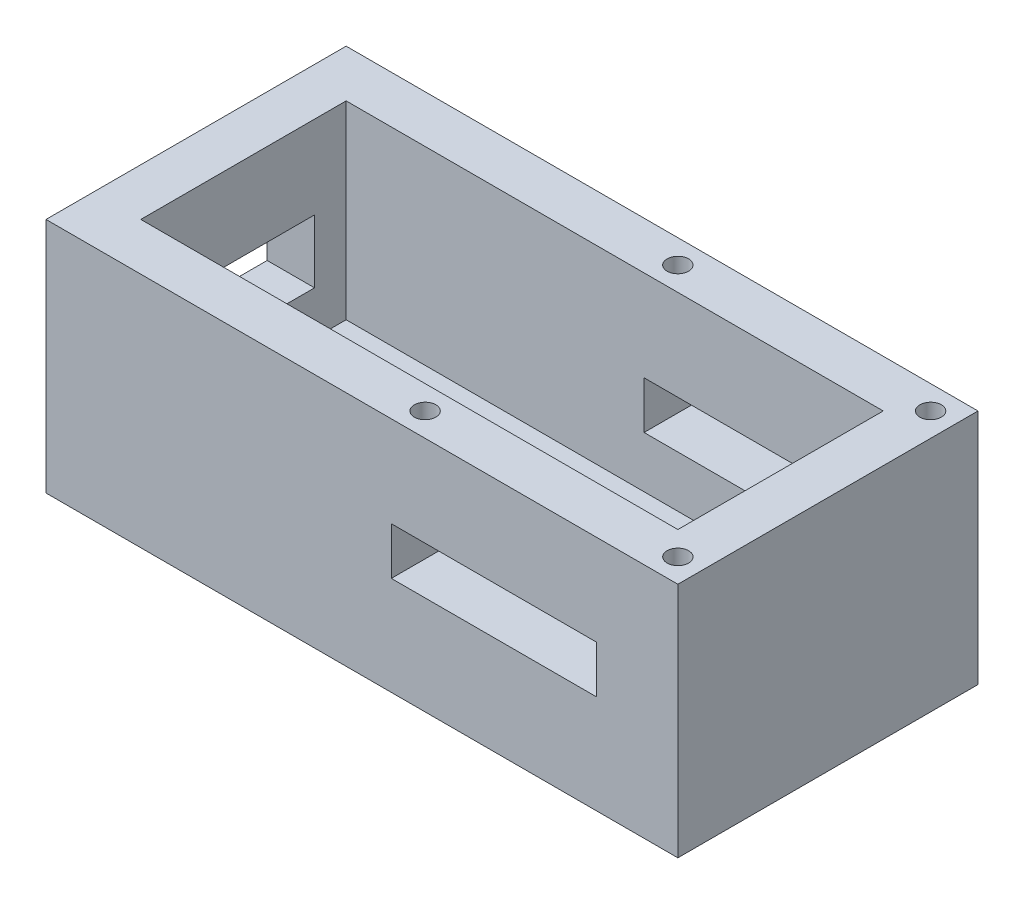
ISO-10303-21;
HEADER;
FILE_DESCRIPTION(('STEP AP214'),'2;1');
FILE_NAME('part.step','',(''),(''),'','','');
FILE_SCHEMA(('AUTOMOTIVE_DESIGN { 1 0 10303 214 1 1 1 1 }'));
ENDSEC;
DATA;
#1=APPLICATION_CONTEXT('core data for automotive mechanical design processes');
#2=APPLICATION_PROTOCOL_DEFINITION('international standard','automotive_design',2000,#1);
#3=PRODUCT_CONTEXT('',#1,'mechanical');
#4=PRODUCT('Part','Part','',(#3));
#5=PRODUCT_RELATED_PRODUCT_CATEGORY('part','',(#4));
#6=PRODUCT_DEFINITION_FORMATION('','',#4);
#7=PRODUCT_DEFINITION_CONTEXT('part definition',#1,'design');
#8=PRODUCT_DEFINITION('design','',#6,#7);
#9=PRODUCT_DEFINITION_SHAPE('','',#8);
#10=(LENGTH_UNIT() NAMED_UNIT(*) SI_UNIT(.MILLI.,.METRE.));
#11=(NAMED_UNIT(*) PLANE_ANGLE_UNIT() SI_UNIT($,.RADIAN.));
#12=(NAMED_UNIT(*) SI_UNIT($,.STERADIAN.) SOLID_ANGLE_UNIT());
#13=UNCERTAINTY_MEASURE_WITH_UNIT(LENGTH_MEASURE(1.E-05),#10,'distance_accuracy_value','');
#14=(GEOMETRIC_REPRESENTATION_CONTEXT(3) GLOBAL_UNCERTAINTY_ASSIGNED_CONTEXT((#13)) GLOBAL_UNIT_ASSIGNED_CONTEXT((#10,
#11,#12)) REPRESENTATION_CONTEXT('',''));
#15=CARTESIAN_POINT('',(0.,0.,0.));
#16=DIRECTION('',(0.,0.,1.));
#17=DIRECTION('',(1.,0.,0.));
#18=AXIS2_PLACEMENT_3D('',#15,#16,#17);
#19=CARTESIAN_POINT('',(0.,38.1,0.));
#20=DIRECTION('',(0.,-1.,0.));
#21=DIRECTION('',(0.,0.,-1.));
#22=AXIS2_PLACEMENT_3D('',#19,#20,#21);
#23=PLANE('',#22);
#24=CARTESIAN_POINT('',(46.99,38.1,-20.32));
#25=DIRECTION('',(0.,1.,0.));
#26=DIRECTION('',(0.,0.,1.));
#27=AXIS2_PLACEMENT_3D('',#24,#25,#26);
#28=CIRCLE('',#27,1.7272);
#29=CARTESIAN_POINT('',(46.99,38.1,-18.5928));
#30=VERTEX_POINT('',#29);
#31=EDGE_CURVE('E207',#30,#30,#28,.T.);
#32=ORIENTED_EDGE('',*,*,#31,.F.);
#33=EDGE_LOOP('',(#32));
#34=FACE_BOUND('',#33,.T.);
#35=CARTESIAN_POINT('',(6.34999999999999,38.1,20.32));
#36=DIRECTION('',(0.,1.,0.));
#37=DIRECTION('',(0.,0.,1.));
#38=AXIS2_PLACEMENT_3D('',#35,#36,#37);
#39=CIRCLE('',#38,1.7272);
#40=CARTESIAN_POINT('',(6.34999999999999,38.1,22.0472));
#41=VERTEX_POINT('',#40);
#42=EDGE_CURVE('E206',#41,#41,#39,.T.);
#43=ORIENTED_EDGE('',*,*,#42,.F.);
#44=EDGE_LOOP('',(#43));
#45=FACE_BOUND('',#44,.T.);
#46=CARTESIAN_POINT('',(6.34999999999999,38.1,-20.32));
#47=DIRECTION('',(0.,1.,0.));
#48=DIRECTION('',(0.,0.,1.));
#49=AXIS2_PLACEMENT_3D('',#46,#47,#48);
#50=CIRCLE('',#49,1.7272);
#51=CARTESIAN_POINT('',(6.34999999999999,38.1,-18.5928));
#52=VERTEX_POINT('',#51);
#53=EDGE_CURVE('E217',#52,#52,#50,.T.);
#54=ORIENTED_EDGE('',*,*,#53,.F.);
#55=EDGE_LOOP('',(#54));
#56=FACE_BOUND('',#55,.T.);
#57=CARTESIAN_POINT('',(46.99,38.1,20.32));
#58=DIRECTION('',(0.,1.,0.));
#59=DIRECTION('',(0.,0.,1.));
#60=AXIS2_PLACEMENT_3D('',#57,#58,#59);
#61=CIRCLE('',#60,1.7272);
#62=CARTESIAN_POINT('',(46.99,38.1,22.0472));
#63=VERTEX_POINT('',#62);
#64=EDGE_CURVE('E223',#63,#63,#61,.T.);
#65=ORIENTED_EDGE('',*,*,#64,.F.);
#66=EDGE_LOOP('',(#65));
#67=FACE_BOUND('',#66,.T.);
#68=DIRECTION('',(0.,0.,-1.));
#69=VECTOR('',#68,1.);
#70=CARTESIAN_POINT('',(50.8,38.1,24.13));
#71=LINE('',#70,#69);
#72=CARTESIAN_POINT('',(50.8,38.1,24.13));
#73=VERTEX_POINT('',#72);
#74=CARTESIAN_POINT('',(50.8,38.1,-24.13));
#75=VERTEX_POINT('',#74);
#76=EDGE_CURVE('E323',#73,#75,#71,.T.);
#77=ORIENTED_EDGE('',*,*,#76,.T.);
#78=DIRECTION('',(-1.,0.,0.));
#79=VECTOR('',#78,1.);
#80=CARTESIAN_POINT('',(-50.8,38.1,-24.13));
#81=LINE('',#80,#79);
#82=CARTESIAN_POINT('',(-50.8,38.1,-24.13));
#83=VERTEX_POINT('',#82);
#84=EDGE_CURVE('E326',#75,#83,#81,.T.);
#85=ORIENTED_EDGE('',*,*,#84,.T.);
#86=DIRECTION('',(0.,0.,1.));
#87=VECTOR('',#86,1.);
#88=CARTESIAN_POINT('',(-50.8,38.1,24.13));
#89=LINE('',#88,#87);
#90=CARTESIAN_POINT('',(-50.8,38.1,24.13));
#91=VERTEX_POINT('',#90);
#92=EDGE_CURVE('E329',#83,#91,#89,.T.);
#93=ORIENTED_EDGE('',*,*,#92,.T.);
#94=DIRECTION('',(1.,0.,0.));
#95=VECTOR('',#94,1.);
#96=CARTESIAN_POINT('',(-50.8,38.1,24.13));
#97=LINE('',#96,#95);
#98=EDGE_CURVE('E331',#91,#73,#97,.T.);
#99=ORIENTED_EDGE('',*,*,#98,.T.);
#100=EDGE_LOOP('',(#77,#85,#93,#99));
#101=FACE_BOUND('',#100,.T.);
#102=DIRECTION('',(0.,0.,-1.));
#103=VECTOR('',#102,1.);
#104=CARTESIAN_POINT('',(43.18,38.1,0.));
#105=LINE('',#104,#103);
#106=CARTESIAN_POINT('',(43.18,38.1,16.51));
#107=VERTEX_POINT('',#106);
#108=CARTESIAN_POINT('',(43.18,38.1,-16.51));
#109=VERTEX_POINT('',#108);
#110=EDGE_CURVE('E315',#107,#109,#105,.T.);
#111=ORIENTED_EDGE('',*,*,#110,.F.);
#112=DIRECTION('',(1.,0.,0.));
#113=VECTOR('',#112,1.);
#114=CARTESIAN_POINT('',(0.,38.1,16.51));
#115=LINE('',#114,#113);
#116=CARTESIAN_POINT('',(-43.18,38.1,16.51));
#117=VERTEX_POINT('',#116);
#118=EDGE_CURVE('E305',#117,#107,#115,.T.);
#119=ORIENTED_EDGE('',*,*,#118,.F.);
#120=DIRECTION('',(0.,0.,1.));
#121=VECTOR('',#120,1.);
#122=CARTESIAN_POINT('',(-43.18,38.1,0.));
#123=LINE('',#122,#121);
#124=CARTESIAN_POINT('',(-43.18,38.1,-16.51));
#125=VERTEX_POINT('',#124);
#126=EDGE_CURVE('E319',#125,#117,#123,.T.);
#127=ORIENTED_EDGE('',*,*,#126,.F.);
#128=DIRECTION('',(-1.,0.,0.));
#129=VECTOR('',#128,1.);
#130=CARTESIAN_POINT('',(0.,38.1,-16.51));
#131=LINE('',#130,#129);
#132=EDGE_CURVE('E317',#109,#125,#131,.T.);
#133=ORIENTED_EDGE('',*,*,#132,.F.);
#134=EDGE_LOOP('',(#111,#119,#127,#133));
#135=FACE_BOUND('',#134,.T.);
#136=ADVANCED_FACE('F47',(#34,#45,#56,#67,#101,#135),#23,.F.);
#137=CARTESIAN_POINT('',(50.8,38.1,24.13));
#138=DIRECTION('',(-1.,0.,0.));
#139=DIRECTION('',(0.,0.,1.));
#140=AXIS2_PLACEMENT_3D('',#137,#138,#139);
#141=PLANE('',#140);
#142=DIRECTION('',(0.,0.,-1.));
#143=VECTOR('',#142,1.);
#144=CARTESIAN_POINT('',(50.8,0.,24.13));
#145=LINE('',#144,#143);
#146=CARTESIAN_POINT('',(50.8,0.,24.13));
#147=VERTEX_POINT('',#146);
#148=CARTESIAN_POINT('',(50.8,0.,-24.13));
#149=VERTEX_POINT('',#148);
#150=EDGE_CURVE('E299',#147,#149,#145,.T.);
#151=ORIENTED_EDGE('',*,*,#150,.T.);
#152=DIRECTION('',(0.,-1.,0.));
#153=VECTOR('',#152,1.);
#154=CARTESIAN_POINT('',(50.8,38.1,-24.13));
#155=LINE('',#154,#153);
#156=EDGE_CURVE('E349',#75,#149,#155,.T.);
#157=ORIENTED_EDGE('',*,*,#156,.F.);
#158=ORIENTED_EDGE('',*,*,#76,.F.);
#159=DIRECTION('',(0.,-1.,0.));
#160=VECTOR('',#159,1.);
#161=CARTESIAN_POINT('',(50.8,38.1,24.13));
#162=LINE('',#161,#160);
#163=EDGE_CURVE('E333',#73,#147,#162,.T.);
#164=ORIENTED_EDGE('',*,*,#163,.T.);
#165=EDGE_LOOP('',(#151,#157,#158,#164));
#166=FACE_BOUND('',#165,.T.);
#167=ADVANCED_FACE('F49',(#166),#141,.F.);
#168=CARTESIAN_POINT('',(-50.8,38.1,-24.13));
#169=DIRECTION('',(0.,0.,1.));
#170=DIRECTION('',(1.,0.,0.));
#171=AXIS2_PLACEMENT_3D('',#168,#169,#170);
#172=PLANE('',#171);
#173=DIRECTION('',(-1.,0.,0.));
#174=VECTOR('',#173,1.);
#175=CARTESIAN_POINT('',(4.72429750585437,15.875,-24.13));
#176=LINE('',#175,#174);
#177=CARTESIAN_POINT('',(37.7442975058544,15.875,-24.13));
#178=VERTEX_POINT('',#177);
#179=CARTESIAN_POINT('',(4.72429750585437,15.875,-24.13));
#180=VERTEX_POINT('',#179);
#181=EDGE_CURVE('E242',#178,#180,#176,.T.);
#182=ORIENTED_EDGE('',*,*,#181,.F.);
#183=DIRECTION('',(0.,-1.,0.));
#184=VECTOR('',#183,1.);
#185=CARTESIAN_POINT('',(37.7442975058544,15.875,-24.13));
#186=LINE('',#185,#184);
#187=CARTESIAN_POINT('',(37.7442975058544,23.495,-24.13));
#188=VERTEX_POINT('',#187);
#189=EDGE_CURVE('E62',#188,#178,#186,.T.);
#190=ORIENTED_EDGE('',*,*,#189,.F.);
#191=DIRECTION('',(1.,0.,0.));
#192=VECTOR('',#191,1.);
#193=CARTESIAN_POINT('',(4.72429750585437,23.495,-24.13));
#194=LINE('',#193,#192);
#195=CARTESIAN_POINT('',(4.72429750585437,23.495,-24.13));
#196=VERTEX_POINT('',#195);
#197=EDGE_CURVE('E233',#196,#188,#194,.T.);
#198=ORIENTED_EDGE('',*,*,#197,.F.);
#199=DIRECTION('',(0.,1.,0.));
#200=VECTOR('',#199,1.);
#201=CARTESIAN_POINT('',(4.72429750585437,15.875,-24.13));
#202=LINE('',#201,#200);
#203=EDGE_CURVE('E245',#180,#196,#202,.T.);
#204=ORIENTED_EDGE('',*,*,#203,.F.);
#205=EDGE_LOOP('',(#182,#190,#198,#204));
#206=FACE_BOUND('',#205,.T.);
#207=DIRECTION('',(-1.,0.,0.));
#208=VECTOR('',#207,1.);
#209=CARTESIAN_POINT('',(-50.8,0.,-24.13));
#210=LINE('',#209,#208);
#211=CARTESIAN_POINT('',(-50.8,0.,-24.13));
#212=VERTEX_POINT('',#211);
#213=EDGE_CURVE('E336',#149,#212,#210,.T.);
#214=ORIENTED_EDGE('',*,*,#213,.T.);
#215=DIRECTION('',(0.,-1.,0.));
#216=VECTOR('',#215,1.);
#217=CARTESIAN_POINT('',(-50.8,38.1,-24.13));
#218=LINE('',#217,#216);
#219=EDGE_CURVE('E346',#83,#212,#218,.T.);
#220=ORIENTED_EDGE('',*,*,#219,.F.);
#221=ORIENTED_EDGE('',*,*,#84,.F.);
#222=ORIENTED_EDGE('',*,*,#156,.T.);
#223=EDGE_LOOP('',(#214,#220,#221,#222));
#224=FACE_BOUND('',#223,.T.);
#225=ADVANCED_FACE('F400',(#206,#224),#172,.F.);
#226=CARTESIAN_POINT('',(-50.8,38.1,24.13));
#227=DIRECTION('',(1.,0.,0.));
#228=DIRECTION('',(0.,0.,-1.));
#229=AXIS2_PLACEMENT_3D('',#226,#227,#228);
#230=PLANE('',#229);
#231=DIRECTION('',(0.,0.,-1.));
#232=VECTOR('',#231,1.);
#233=CARTESIAN_POINT('',(-50.8,24.765,-11.43));
#234=LINE('',#233,#232);
#235=CARTESIAN_POINT('',(-50.8,24.765,11.43));
#236=VERTEX_POINT('',#235);
#237=CARTESIAN_POINT('',(-50.8,24.765,-11.43));
#238=VERTEX_POINT('',#237);
#239=EDGE_CURVE('E274',#236,#238,#234,.T.);
#240=ORIENTED_EDGE('',*,*,#239,.F.);
#241=DIRECTION('',(0.,1.,0.));
#242=VECTOR('',#241,1.);
#243=CARTESIAN_POINT('',(-50.8,14.605,11.43));
#244=LINE('',#243,#242);
#245=CARTESIAN_POINT('',(-50.8,14.605,11.43));
#246=VERTEX_POINT('',#245);
#247=EDGE_CURVE('E272',#246,#236,#244,.T.);
#248=ORIENTED_EDGE('',*,*,#247,.F.);
#249=DIRECTION('',(0.,0.,1.));
#250=VECTOR('',#249,1.);
#251=CARTESIAN_POINT('',(-50.8,14.605,-11.43));
#252=LINE('',#251,#250);
#253=CARTESIAN_POINT('',(-50.8,14.605,-11.43));
#254=VERTEX_POINT('',#253);
#255=EDGE_CURVE('E280',#254,#246,#252,.T.);
#256=ORIENTED_EDGE('',*,*,#255,.F.);
#257=DIRECTION('',(0.,-1.,0.));
#258=VECTOR('',#257,1.);
#259=CARTESIAN_POINT('',(-50.8,14.605,-11.43));
#260=LINE('',#259,#258);
#261=EDGE_CURVE('E277',#238,#254,#260,.T.);
#262=ORIENTED_EDGE('',*,*,#261,.F.);
#263=EDGE_LOOP('',(#240,#248,#256,#262));
#264=FACE_BOUND('',#263,.T.);
#265=DIRECTION('',(0.,0.,1.));
#266=VECTOR('',#265,1.);
#267=CARTESIAN_POINT('',(-50.8,0.,24.13));
#268=LINE('',#267,#266);
#269=CARTESIAN_POINT('',(-50.8,0.,24.13));
#270=VERTEX_POINT('',#269);
#271=EDGE_CURVE('E338',#212,#270,#268,.T.);
#272=ORIENTED_EDGE('',*,*,#271,.T.);
#273=DIRECTION('',(0.,-1.,0.));
#274=VECTOR('',#273,1.);
#275=CARTESIAN_POINT('',(-50.8,38.1,24.13));
#276=LINE('',#275,#274);
#277=EDGE_CURVE('E343',#91,#270,#276,.T.);
#278=ORIENTED_EDGE('',*,*,#277,.F.);
#279=ORIENTED_EDGE('',*,*,#92,.F.);
#280=ORIENTED_EDGE('',*,*,#219,.T.);
#281=EDGE_LOOP('',(#272,#278,#279,#280));
#282=FACE_BOUND('',#281,.T.);
#283=ADVANCED_FACE('F386',(#264,#282),#230,.F.);
#284=CARTESIAN_POINT('',(-50.8,38.1,24.13));
#285=DIRECTION('',(0.,0.,-1.));
#286=DIRECTION('',(-1.,0.,0.));
#287=AXIS2_PLACEMENT_3D('',#284,#285,#286);
#288=PLANE('',#287);
#289=DIRECTION('',(1.,0.,0.));
#290=VECTOR('',#289,1.);
#291=CARTESIAN_POINT('',(4.72429750585437,23.495,24.13));
#292=LINE('',#291,#290);
#293=CARTESIAN_POINT('',(4.72429750585437,23.495,24.13));
#294=VERTEX_POINT('',#293);
#295=CARTESIAN_POINT('',(37.7442975058544,23.495,24.13));
#296=VERTEX_POINT('',#295);
#297=EDGE_CURVE('E237',#294,#296,#292,.T.);
#298=ORIENTED_EDGE('',*,*,#297,.T.);
#299=DIRECTION('',(0.,-1.,0.));
#300=VECTOR('',#299,1.);
#301=CARTESIAN_POINT('',(37.7442975058544,15.875,24.13));
#302=LINE('',#301,#300);
#303=CARTESIAN_POINT('',(37.7442975058544,15.875,24.13));
#304=VERTEX_POINT('',#303);
#305=EDGE_CURVE('E229',#296,#304,#302,.T.);
#306=ORIENTED_EDGE('',*,*,#305,.T.);
#307=DIRECTION('',(-1.,0.,0.));
#308=VECTOR('',#307,1.);
#309=CARTESIAN_POINT('',(4.72429750585437,15.875,24.13));
#310=LINE('',#309,#308);
#311=CARTESIAN_POINT('',(4.72429750585437,15.875,24.13));
#312=VERTEX_POINT('',#311);
#313=EDGE_CURVE('E232',#304,#312,#310,.T.);
#314=ORIENTED_EDGE('',*,*,#313,.T.);
#315=DIRECTION('',(0.,1.,0.));
#316=VECTOR('',#315,1.);
#317=CARTESIAN_POINT('',(4.72429750585437,15.875,24.13));
#318=LINE('',#317,#316);
#319=EDGE_CURVE('E70',#312,#294,#318,.T.);
#320=ORIENTED_EDGE('',*,*,#319,.T.);
#321=EDGE_LOOP('',(#298,#306,#314,#320));
#322=FACE_BOUND('',#321,.T.);
#323=DIRECTION('',(1.,0.,0.));
#324=VECTOR('',#323,1.);
#325=CARTESIAN_POINT('',(-50.8,0.,24.13));
#326=LINE('',#325,#324);
#327=EDGE_CURVE('E327',#270,#147,#326,.T.);
#328=ORIENTED_EDGE('',*,*,#327,.T.);
#329=ORIENTED_EDGE('',*,*,#163,.F.);
#330=ORIENTED_EDGE('',*,*,#98,.F.);
#331=ORIENTED_EDGE('',*,*,#277,.T.);
#332=EDGE_LOOP('',(#328,#329,#330,#331));
#333=FACE_BOUND('',#332,.T.);
#334=ADVANCED_FACE('F382',(#322,#333),#288,.F.);
#335=CARTESIAN_POINT('',(0.,0.,0.));
#336=DIRECTION('',(0.,-1.,0.));
#337=DIRECTION('',(0.,0.,-1.));
#338=AXIS2_PLACEMENT_3D('',#335,#336,#337);
#339=PLANE('',#338);
#340=ORIENTED_EDGE('',*,*,#150,.F.);
#341=ORIENTED_EDGE('',*,*,#327,.F.);
#342=ORIENTED_EDGE('',*,*,#271,.F.);
#343=ORIENTED_EDGE('',*,*,#213,.F.);
#344=EDGE_LOOP('',(#340,#341,#342,#343));
#345=FACE_BOUND('',#344,.T.);
#346=ADVANCED_FACE('F385',(#345),#339,.T.);
#347=CARTESIAN_POINT('',(43.18,38.1,24.13));
#348=DIRECTION('',(-1.,0.,0.));
#349=DIRECTION('',(0.,0.,1.));
#350=AXIS2_PLACEMENT_3D('',#347,#348,#349);
#351=PLANE('',#350);
#352=DIRECTION('',(0.,0.,-1.));
#353=VECTOR('',#352,1.);
#354=CARTESIAN_POINT('',(43.18,7.62,0.));
#355=LINE('',#354,#353);
#356=CARTESIAN_POINT('',(43.18,7.62,16.51));
#357=VERTEX_POINT('',#356);
#358=CARTESIAN_POINT('',(43.18,7.62,-16.51));
#359=VERTEX_POINT('',#358);
#360=EDGE_CURVE('E286',#357,#359,#355,.T.);
#361=ORIENTED_EDGE('',*,*,#360,.F.);
#362=DIRECTION('',(0.,-1.,0.));
#363=VECTOR('',#362,1.);
#364=CARTESIAN_POINT('',(43.18,38.1,16.51));
#365=LINE('',#364,#363);
#366=EDGE_CURVE('E301',#107,#357,#365,.T.);
#367=ORIENTED_EDGE('',*,*,#366,.F.);
#368=ORIENTED_EDGE('',*,*,#110,.T.);
#369=DIRECTION('',(0.,-1.,0.));
#370=VECTOR('',#369,1.);
#371=CARTESIAN_POINT('',(43.18,38.1,-16.51));
#372=LINE('',#371,#370);
#373=EDGE_CURVE('E296',#109,#359,#372,.T.);
#374=ORIENTED_EDGE('',*,*,#373,.T.);
#375=EDGE_LOOP('',(#361,#367,#368,#374));
#376=FACE_BOUND('',#375,.T.);
#377=ADVANCED_FACE('F430',(#376),#351,.T.);
#378=CARTESIAN_POINT('',(-50.8,38.1,-16.51));
#379=DIRECTION('',(0.,0.,1.));
#380=DIRECTION('',(1.,0.,0.));
#381=AXIS2_PLACEMENT_3D('',#378,#379,#380);
#382=PLANE('',#381);
#383=DIRECTION('',(0.,1.,0.));
#384=VECTOR('',#383,1.);
#385=CARTESIAN_POINT('',(37.7442975058544,38.1,-16.51));
#386=LINE('',#385,#384);
#387=CARTESIAN_POINT('',(37.7442975058544,15.875,-16.51));
#388=VERTEX_POINT('',#387);
#389=CARTESIAN_POINT('',(37.7442975058544,23.495,-16.51));
#390=VERTEX_POINT('',#389);
#391=EDGE_CURVE('E270',#388,#390,#386,.T.);
#392=ORIENTED_EDGE('',*,*,#391,.F.);
#393=DIRECTION('',(1.,0.,0.));
#394=VECTOR('',#393,1.);
#395=CARTESIAN_POINT('',(-50.8,15.875,-16.51));
#396=LINE('',#395,#394);
#397=CARTESIAN_POINT('',(4.72429750585437,15.875,-16.51));
#398=VERTEX_POINT('',#397);
#399=EDGE_CURVE('E253',#398,#388,#396,.T.);
#400=ORIENTED_EDGE('',*,*,#399,.F.);
#401=DIRECTION('',(0.,-1.,0.));
#402=VECTOR('',#401,1.);
#403=CARTESIAN_POINT('',(4.72429750585437,38.1,-16.51));
#404=LINE('',#403,#402);
#405=CARTESIAN_POINT('',(4.72429750585437,23.495,-16.51));
#406=VERTEX_POINT('',#405);
#407=EDGE_CURVE('E265',#406,#398,#404,.T.);
#408=ORIENTED_EDGE('',*,*,#407,.F.);
#409=DIRECTION('',(-1.,0.,0.));
#410=VECTOR('',#409,1.);
#411=CARTESIAN_POINT('',(-50.8,23.495,-16.51));
#412=LINE('',#411,#410);
#413=EDGE_CURVE('E268',#390,#406,#412,.T.);
#414=ORIENTED_EDGE('',*,*,#413,.F.);
#415=EDGE_LOOP('',(#392,#400,#408,#414));
#416=FACE_BOUND('',#415,.T.);
#417=DIRECTION('',(-1.,0.,0.));
#418=VECTOR('',#417,1.);
#419=CARTESIAN_POINT('',(0.,7.62,-16.51));
#420=LINE('',#419,#418);
#421=CARTESIAN_POINT('',(-43.18,7.62,-16.51));
#422=VERTEX_POINT('',#421);
#423=EDGE_CURVE('E295',#359,#422,#420,.T.);
#424=ORIENTED_EDGE('',*,*,#423,.F.);
#425=ORIENTED_EDGE('',*,*,#373,.F.);
#426=ORIENTED_EDGE('',*,*,#132,.T.);
#427=DIRECTION('',(0.,-1.,0.));
#428=VECTOR('',#427,1.);
#429=CARTESIAN_POINT('',(-43.18,38.1,-16.51));
#430=LINE('',#429,#428);
#431=EDGE_CURVE('E300',#125,#422,#430,.T.);
#432=ORIENTED_EDGE('',*,*,#431,.T.);
#433=EDGE_LOOP('',(#424,#425,#426,#432));
#434=FACE_BOUND('',#433,.T.);
#435=ADVANCED_FACE('F434',(#416,#434),#382,.T.);
#436=CARTESIAN_POINT('',(-43.18,38.1,24.13));
#437=DIRECTION('',(1.,0.,0.));
#438=DIRECTION('',(0.,0.,-1.));
#439=AXIS2_PLACEMENT_3D('',#436,#437,#438);
#440=PLANE('',#439);
#441=DIRECTION('',(0.,-1.,0.));
#442=VECTOR('',#441,1.);
#443=CARTESIAN_POINT('',(-43.18,38.1,11.43));
#444=LINE('',#443,#442);
#445=CARTESIAN_POINT('',(-43.18,24.765,11.43));
#446=VERTEX_POINT('',#445);
#447=CARTESIAN_POINT('',(-43.18,14.605,11.43));
#448=VERTEX_POINT('',#447);
#449=EDGE_CURVE('E359',#446,#448,#444,.T.);
#450=ORIENTED_EDGE('',*,*,#449,.F.);
#451=DIRECTION('',(0.,0.,1.));
#452=VECTOR('',#451,1.);
#453=CARTESIAN_POINT('',(-43.18,24.765,24.13));
#454=LINE('',#453,#452);
#455=CARTESIAN_POINT('',(-43.18,24.765,-11.43));
#456=VERTEX_POINT('',#455);
#457=EDGE_CURVE('E352',#456,#446,#454,.T.);
#458=ORIENTED_EDGE('',*,*,#457,.F.);
#459=DIRECTION('',(0.,1.,0.));
#460=VECTOR('',#459,1.);
#461=CARTESIAN_POINT('',(-43.18,38.1,-11.43));
#462=LINE('',#461,#460);
#463=CARTESIAN_POINT('',(-43.18,14.605,-11.43));
#464=VERTEX_POINT('',#463);
#465=EDGE_CURVE('E354',#464,#456,#462,.T.);
#466=ORIENTED_EDGE('',*,*,#465,.F.);
#467=DIRECTION('',(0.,0.,-1.));
#468=VECTOR('',#467,1.);
#469=CARTESIAN_POINT('',(-43.18,14.605,24.13));
#470=LINE('',#469,#468);
#471=EDGE_CURVE('E357',#448,#464,#470,.T.);
#472=ORIENTED_EDGE('',*,*,#471,.F.);
#473=EDGE_LOOP('',(#450,#458,#466,#472));
#474=FACE_BOUND('',#473,.T.);
#475=DIRECTION('',(0.,0.,1.));
#476=VECTOR('',#475,1.);
#477=CARTESIAN_POINT('',(-43.18,7.62,0.));
#478=LINE('',#477,#476);
#479=CARTESIAN_POINT('',(-43.18,7.62,16.51));
#480=VERTEX_POINT('',#479);
#481=EDGE_CURVE('E307',#422,#480,#478,.T.);
#482=ORIENTED_EDGE('',*,*,#481,.F.);
#483=ORIENTED_EDGE('',*,*,#431,.F.);
#484=ORIENTED_EDGE('',*,*,#126,.T.);
#485=DIRECTION('',(0.,-1.,0.));
#486=VECTOR('',#485,1.);
#487=CARTESIAN_POINT('',(-43.18,38.1,16.51));
#488=LINE('',#487,#486);
#489=EDGE_CURVE('E304',#117,#480,#488,.T.);
#490=ORIENTED_EDGE('',*,*,#489,.T.);
#491=EDGE_LOOP('',(#482,#483,#484,#490));
#492=FACE_BOUND('',#491,.T.);
#493=ADVANCED_FACE('F440',(#474,#492),#440,.T.);
#494=CARTESIAN_POINT('',(-50.8,38.1,16.51));
#495=DIRECTION('',(0.,0.,-1.));
#496=DIRECTION('',(-1.,0.,0.));
#497=AXIS2_PLACEMENT_3D('',#494,#495,#496);
#498=PLANE('',#497);
#499=DIRECTION('',(0.,-1.,0.));
#500=VECTOR('',#499,1.);
#501=CARTESIAN_POINT('',(37.7442975058544,38.1,16.51));
#502=LINE('',#501,#500);
#503=CARTESIAN_POINT('',(37.7442975058544,23.495,16.51));
#504=VERTEX_POINT('',#503);
#505=CARTESIAN_POINT('',(37.7442975058544,15.875,16.51));
#506=VERTEX_POINT('',#505);
#507=EDGE_CURVE('E11',#504,#506,#502,.T.);
#508=ORIENTED_EDGE('',*,*,#507,.F.);
#509=DIRECTION('',(1.,0.,0.));
#510=VECTOR('',#509,1.);
#511=CARTESIAN_POINT('',(-50.8,23.495,16.51));
#512=LINE('',#511,#510);
#513=CARTESIAN_POINT('',(4.72429750585437,23.495,16.51));
#514=VERTEX_POINT('',#513);
#515=EDGE_CURVE('E55',#514,#504,#512,.T.);
#516=ORIENTED_EDGE('',*,*,#515,.F.);
#517=DIRECTION('',(0.,1.,0.));
#518=VECTOR('',#517,1.);
#519=CARTESIAN_POINT('',(4.72429750585437,38.1,16.51));
#520=LINE('',#519,#518);
#521=CARTESIAN_POINT('',(4.72429750585437,15.875,16.51));
#522=VERTEX_POINT('',#521);
#523=EDGE_CURVE('E363',#522,#514,#520,.T.);
#524=ORIENTED_EDGE('',*,*,#523,.F.);
#525=DIRECTION('',(-1.,0.,0.));
#526=VECTOR('',#525,1.);
#527=CARTESIAN_POINT('',(-50.8,15.875,16.51));
#528=LINE('',#527,#526);
#529=EDGE_CURVE('E361',#506,#522,#528,.T.);
#530=ORIENTED_EDGE('',*,*,#529,.F.);
#531=EDGE_LOOP('',(#508,#516,#524,#530));
#532=FACE_BOUND('',#531,.T.);
#533=DIRECTION('',(1.,0.,0.));
#534=VECTOR('',#533,1.);
#535=CARTESIAN_POINT('',(0.,7.62,16.51));
#536=LINE('',#535,#534);
#537=EDGE_CURVE('E311',#480,#357,#536,.T.);
#538=ORIENTED_EDGE('',*,*,#537,.F.);
#539=ORIENTED_EDGE('',*,*,#489,.F.);
#540=ORIENTED_EDGE('',*,*,#118,.T.);
#541=ORIENTED_EDGE('',*,*,#366,.T.);
#542=EDGE_LOOP('',(#538,#539,#540,#541));
#543=FACE_BOUND('',#542,.T.);
#544=ADVANCED_FACE('F375',(#532,#543),#498,.T.);
#545=CARTESIAN_POINT('',(0.,7.62,0.));
#546=DIRECTION('',(0.,-1.,0.));
#547=DIRECTION('',(0.,0.,-1.));
#548=AXIS2_PLACEMENT_3D('',#545,#546,#547);
#549=PLANE('',#548);
#550=ORIENTED_EDGE('',*,*,#360,.T.);
#551=ORIENTED_EDGE('',*,*,#423,.T.);
#552=ORIENTED_EDGE('',*,*,#481,.T.);
#553=ORIENTED_EDGE('',*,*,#537,.T.);
#554=EDGE_LOOP('',(#550,#551,#552,#553));
#555=FACE_BOUND('',#554,.T.);
#556=ADVANCED_FACE('F427',(#555),#549,.F.);
#557=CARTESIAN_POINT('',(-12.7,14.605,11.43));
#558=DIRECTION('',(0.,0.,1.));
#559=DIRECTION('',(0.,-1.,0.));
#560=AXIS2_PLACEMENT_3D('',#557,#558,#559);
#561=PLANE('',#560);
#562=ORIENTED_EDGE('',*,*,#449,.T.);
#563=DIRECTION('',(-1.,0.,0.));
#564=VECTOR('',#563,1.);
#565=CARTESIAN_POINT('',(-12.7,14.605,11.43));
#566=LINE('',#565,#564);
#567=EDGE_CURVE('E284',#448,#246,#566,.T.);
#568=ORIENTED_EDGE('',*,*,#567,.T.);
#569=ORIENTED_EDGE('',*,*,#247,.T.);
#570=DIRECTION('',(-1.,0.,0.));
#571=VECTOR('',#570,1.);
#572=CARTESIAN_POINT('',(-12.7,24.765,11.43));
#573=LINE('',#572,#571);
#574=EDGE_CURVE('E283',#446,#236,#573,.T.);
#575=ORIENTED_EDGE('',*,*,#574,.F.);
#576=EDGE_LOOP('',(#562,#568,#569,#575));
#577=FACE_BOUND('',#576,.T.);
#578=ADVANCED_FACE('F445',(#577),#561,.F.);
#579=CARTESIAN_POINT('',(-12.7,14.605,-11.43));
#580=DIRECTION('',(0.,-1.,0.));
#581=DIRECTION('',(0.,0.,-1.));
#582=AXIS2_PLACEMENT_3D('',#579,#580,#581);
#583=PLANE('',#582);
#584=ORIENTED_EDGE('',*,*,#471,.T.);
#585=DIRECTION('',(-1.,0.,0.));
#586=VECTOR('',#585,1.);
#587=CARTESIAN_POINT('',(-12.7,14.605,-11.43));
#588=LINE('',#587,#586);
#589=EDGE_CURVE('E287',#464,#254,#588,.T.);
#590=ORIENTED_EDGE('',*,*,#589,.T.);
#591=ORIENTED_EDGE('',*,*,#255,.T.);
#592=ORIENTED_EDGE('',*,*,#567,.F.);
#593=EDGE_LOOP('',(#584,#590,#591,#592));
#594=FACE_BOUND('',#593,.T.);
#595=ADVANCED_FACE('F457',(#594),#583,.F.);
#596=CARTESIAN_POINT('',(-12.7,14.605,-11.43));
#597=DIRECTION('',(0.,0.,-1.));
#598=DIRECTION('',(0.,1.,0.));
#599=AXIS2_PLACEMENT_3D('',#596,#597,#598);
#600=PLANE('',#599);
#601=ORIENTED_EDGE('',*,*,#465,.T.);
#602=DIRECTION('',(-1.,0.,0.));
#603=VECTOR('',#602,1.);
#604=CARTESIAN_POINT('',(-12.7,24.765,-11.43));
#605=LINE('',#604,#603);
#606=EDGE_CURVE('E289',#456,#238,#605,.T.);
#607=ORIENTED_EDGE('',*,*,#606,.T.);
#608=ORIENTED_EDGE('',*,*,#261,.T.);
#609=ORIENTED_EDGE('',*,*,#589,.F.);
#610=EDGE_LOOP('',(#601,#607,#608,#609));
#611=FACE_BOUND('',#610,.T.);
#612=ADVANCED_FACE('F473',(#611),#600,.F.);
#613=CARTESIAN_POINT('',(-12.7,24.765,-11.43));
#614=DIRECTION('',(0.,1.,0.));
#615=DIRECTION('',(0.,0.,1.));
#616=AXIS2_PLACEMENT_3D('',#613,#614,#615);
#617=PLANE('',#616);
#618=ORIENTED_EDGE('',*,*,#457,.T.);
#619=ORIENTED_EDGE('',*,*,#574,.T.);
#620=ORIENTED_EDGE('',*,*,#239,.T.);
#621=ORIENTED_EDGE('',*,*,#606,.F.);
#622=EDGE_LOOP('',(#618,#619,#620,#621));
#623=FACE_BOUND('',#622,.T.);
#624=ADVANCED_FACE('F488',(#623),#617,.F.);
#625=CARTESIAN_POINT('',(4.72429750585437,15.875,24.13));
#626=DIRECTION('',(0.,-1.,0.));
#627=DIRECTION('',(1.,0.,0.));
#628=AXIS2_PLACEMENT_3D('',#625,#626,#627);
#629=PLANE('',#628);
#630=ORIENTED_EDGE('',*,*,#529,.T.);
#631=DIRECTION('',(0.,0.,-1.));
#632=VECTOR('',#631,1.);
#633=CARTESIAN_POINT('',(4.72429750585437,15.875,24.13));
#634=LINE('',#633,#632);
#635=EDGE_CURVE('E259',#312,#522,#634,.T.);
#636=ORIENTED_EDGE('',*,*,#635,.F.);
#637=ORIENTED_EDGE('',*,*,#313,.F.);
#638=DIRECTION('',(0.,0.,-1.));
#639=VECTOR('',#638,1.);
#640=CARTESIAN_POINT('',(37.7442975058544,15.875,24.13));
#641=LINE('',#640,#639);
#642=EDGE_CURVE('E262',#304,#506,#641,.T.);
#643=ORIENTED_EDGE('',*,*,#642,.T.);
#644=EDGE_LOOP('',(#630,#636,#637,#643));
#645=FACE_BOUND('',#644,.T.);
#646=ADVANCED_FACE('F378',(#645),#629,.F.);
#647=CARTESIAN_POINT('',(4.72429750585437,15.875,24.13));
#648=DIRECTION('',(-1.,0.,0.));
#649=DIRECTION('',(0.,0.,1.));
#650=AXIS2_PLACEMENT_3D('',#647,#648,#649);
#651=PLANE('',#650);
#652=ORIENTED_EDGE('',*,*,#523,.T.);
#653=DIRECTION('',(0.,0.,-1.));
#654=VECTOR('',#653,1.);
#655=CARTESIAN_POINT('',(4.72429750585437,23.495,24.13));
#656=LINE('',#655,#654);
#657=EDGE_CURVE('E255',#294,#514,#656,.T.);
#658=ORIENTED_EDGE('',*,*,#657,.F.);
#659=ORIENTED_EDGE('',*,*,#319,.F.);
#660=ORIENTED_EDGE('',*,*,#635,.T.);
#661=EDGE_LOOP('',(#652,#658,#659,#660));
#662=FACE_BOUND('',#661,.T.);
#663=ADVANCED_FACE('F380',(#662),#651,.F.);
#664=CARTESIAN_POINT('',(4.72429750585437,23.495,24.13));
#665=DIRECTION('',(0.,1.,0.));
#666=DIRECTION('',(-1.,0.,0.));
#667=AXIS2_PLACEMENT_3D('',#664,#665,#666);
#668=PLANE('',#667);
#669=ORIENTED_EDGE('',*,*,#515,.T.);
#670=DIRECTION('',(0.,0.,-1.));
#671=VECTOR('',#670,1.);
#672=CARTESIAN_POINT('',(37.7442975058544,23.495,24.13));
#673=LINE('',#672,#671);
#674=EDGE_CURVE('E250',#296,#504,#673,.T.);
#675=ORIENTED_EDGE('',*,*,#674,.F.);
#676=ORIENTED_EDGE('',*,*,#297,.F.);
#677=ORIENTED_EDGE('',*,*,#657,.T.);
#678=EDGE_LOOP('',(#669,#675,#676,#677));
#679=FACE_BOUND('',#678,.T.);
#680=ADVANCED_FACE('F366',(#679),#668,.F.);
#681=CARTESIAN_POINT('',(37.7442975058544,15.875,24.13));
#682=DIRECTION('',(1.,0.,0.));
#683=DIRECTION('',(0.,0.,-1.));
#684=AXIS2_PLACEMENT_3D('',#681,#682,#683);
#685=PLANE('',#684);
#686=ORIENTED_EDGE('',*,*,#507,.T.);
#687=ORIENTED_EDGE('',*,*,#642,.F.);
#688=ORIENTED_EDGE('',*,*,#305,.F.);
#689=ORIENTED_EDGE('',*,*,#674,.T.);
#690=EDGE_LOOP('',(#686,#687,#688,#689));
#691=FACE_BOUND('',#690,.T.);
#692=ADVANCED_FACE('F373',(#691),#685,.F.);
#693=ORIENTED_EDGE('',*,*,#391,.T.);
#694=EDGE_CURVE('E254',#390,#188,#673,.T.);
#695=ORIENTED_EDGE('',*,*,#694,.T.);
#696=ORIENTED_EDGE('',*,*,#189,.T.);
#697=EDGE_CURVE('E240',#388,#178,#641,.T.);
#698=ORIENTED_EDGE('',*,*,#697,.F.);
#699=EDGE_LOOP('',(#693,#695,#696,#698));
#700=FACE_BOUND('',#699,.T.);
#701=ADVANCED_FACE('F498',(#700),#685,.F.);
#702=ORIENTED_EDGE('',*,*,#413,.T.);
#703=EDGE_CURVE('E258',#406,#196,#656,.T.);
#704=ORIENTED_EDGE('',*,*,#703,.T.);
#705=ORIENTED_EDGE('',*,*,#197,.T.);
#706=ORIENTED_EDGE('',*,*,#694,.F.);
#707=EDGE_LOOP('',(#702,#704,#705,#706));
#708=FACE_BOUND('',#707,.T.);
#709=ADVANCED_FACE('F505',(#708),#668,.F.);
#710=ORIENTED_EDGE('',*,*,#407,.T.);
#711=EDGE_CURVE('E261',#398,#180,#634,.T.);
#712=ORIENTED_EDGE('',*,*,#711,.T.);
#713=ORIENTED_EDGE('',*,*,#203,.T.);
#714=ORIENTED_EDGE('',*,*,#703,.F.);
#715=EDGE_LOOP('',(#710,#712,#713,#714));
#716=FACE_BOUND('',#715,.T.);
#717=ADVANCED_FACE('F502',(#716),#651,.F.);
#718=ORIENTED_EDGE('',*,*,#399,.T.);
#719=ORIENTED_EDGE('',*,*,#697,.T.);
#720=ORIENTED_EDGE('',*,*,#181,.T.);
#721=ORIENTED_EDGE('',*,*,#711,.F.);
#722=EDGE_LOOP('',(#718,#719,#720,#721));
#723=FACE_BOUND('',#722,.T.);
#724=ADVANCED_FACE('F494',(#723),#629,.F.);
#725=CARTESIAN_POINT('',(46.99,26.035,20.32));
#726=DIRECTION('',(0.,1.,0.));
#727=DIRECTION('',(0.,0.,1.));
#728=AXIS2_PLACEMENT_3D('',#725,#726,#727);
#729=CONICAL_SURFACE('',#728,1.7272,1.02974425867665);
#730=CARTESIAN_POINT('',(46.99,24.9971935388156,20.32));
#731=VERTEX_POINT('',#730);
#732=VERTEX_LOOP('',#731);
#733=FACE_BOUND('',#732,.T.);
#734=CARTESIAN_POINT('',(46.99,26.035,20.32));
#735=DIRECTION('',(0.,1.,0.));
#736=DIRECTION('',(0.,0.,1.));
#737=AXIS2_PLACEMENT_3D('',#734,#735,#736);
#738=CIRCLE('',#737,1.7272);
#739=CARTESIAN_POINT('',(46.99,26.035,22.0472));
#740=VERTEX_POINT('',#739);
#741=EDGE_CURVE('E226',#740,#740,#738,.T.);
#742=ORIENTED_EDGE('',*,*,#741,.T.);
#743=EDGE_LOOP('',(#742));
#744=FACE_BOUND('',#743,.T.);
#745=ADVANCED_FACE('F506',(#733,#744),#729,.F.);
#746=CARTESIAN_POINT('',(46.99,38.1,20.32));
#747=DIRECTION('',(0.,1.,0.));
#748=DIRECTION('',(0.,0.,1.));
#749=AXIS2_PLACEMENT_3D('',#746,#747,#748);
#750=CYLINDRICAL_SURFACE('',#749,1.7272);
#751=ORIENTED_EDGE('',*,*,#741,.F.);
#752=EDGE_LOOP('',(#751));
#753=FACE_BOUND('',#752,.T.);
#754=ORIENTED_EDGE('',*,*,#64,.T.);
#755=EDGE_LOOP('',(#754));
#756=FACE_BOUND('',#755,.T.);
#757=ADVANCED_FACE('F509',(#753,#756),#750,.F.);
#758=CARTESIAN_POINT('',(6.34999999999999,26.035,-20.32));
#759=DIRECTION('',(0.,1.,0.));
#760=DIRECTION('',(0.,0.,1.));
#761=AXIS2_PLACEMENT_3D('',#758,#759,#760);
#762=CONICAL_SURFACE('',#761,1.7272,1.02974425867665);
#763=CARTESIAN_POINT('',(6.34999999999999,24.9971935388156,-20.32));
#764=VERTEX_POINT('',#763);
#765=VERTEX_LOOP('',#764);
#766=FACE_BOUND('',#765,.T.);
#767=CARTESIAN_POINT('',(6.34999999999999,26.035,-20.32));
#768=DIRECTION('',(0.,1.,0.));
#769=DIRECTION('',(0.,0.,1.));
#770=AXIS2_PLACEMENT_3D('',#767,#768,#769);
#771=CIRCLE('',#770,1.7272);
#772=CARTESIAN_POINT('',(6.34999999999999,26.035,-18.5928));
#773=VERTEX_POINT('',#772);
#774=EDGE_CURVE('E220',#773,#773,#771,.T.);
#775=ORIENTED_EDGE('',*,*,#774,.T.);
#776=EDGE_LOOP('',(#775));
#777=FACE_BOUND('',#776,.T.);
#778=ADVANCED_FACE('F512',(#766,#777),#762,.F.);
#779=CARTESIAN_POINT('',(6.34999999999999,38.1,-20.32));
#780=DIRECTION('',(0.,1.,0.));
#781=DIRECTION('',(0.,0.,1.));
#782=AXIS2_PLACEMENT_3D('',#779,#780,#781);
#783=CYLINDRICAL_SURFACE('',#782,1.7272);
#784=ORIENTED_EDGE('',*,*,#774,.F.);
#785=EDGE_LOOP('',(#784));
#786=FACE_BOUND('',#785,.T.);
#787=ORIENTED_EDGE('',*,*,#53,.T.);
#788=EDGE_LOOP('',(#787));
#789=FACE_BOUND('',#788,.T.);
#790=ADVANCED_FACE('F516',(#786,#789),#783,.F.);
#791=CARTESIAN_POINT('',(6.34999999999999,26.035,20.32));
#792=DIRECTION('',(0.,1.,0.));
#793=DIRECTION('',(0.,0.,1.));
#794=AXIS2_PLACEMENT_3D('',#791,#792,#793);
#795=CONICAL_SURFACE('',#794,1.7272,1.02974425867665);
#796=CARTESIAN_POINT('',(6.34999999999999,24.9971935388156,20.32));
#797=VERTEX_POINT('',#796);
#798=VERTEX_LOOP('',#797);
#799=FACE_BOUND('',#798,.T.);
#800=CARTESIAN_POINT('',(6.34999999999999,26.035,20.32));
#801=DIRECTION('',(0.,1.,0.));
#802=DIRECTION('',(0.,0.,1.));
#803=AXIS2_PLACEMENT_3D('',#800,#801,#802);
#804=CIRCLE('',#803,1.7272);
#805=CARTESIAN_POINT('',(6.34999999999999,26.035,22.0472));
#806=VERTEX_POINT('',#805);
#807=EDGE_CURVE('E210',#806,#806,#804,.T.);
#808=ORIENTED_EDGE('',*,*,#807,.T.);
#809=EDGE_LOOP('',(#808));
#810=FACE_BOUND('',#809,.T.);
#811=ADVANCED_FACE('F520',(#799,#810),#795,.F.);
#812=CARTESIAN_POINT('',(6.34999999999999,38.1,20.32));
#813=DIRECTION('',(0.,1.,0.));
#814=DIRECTION('',(0.,0.,1.));
#815=AXIS2_PLACEMENT_3D('',#812,#813,#814);
#816=CYLINDRICAL_SURFACE('',#815,1.7272);
#817=ORIENTED_EDGE('',*,*,#807,.F.);
#818=EDGE_LOOP('',(#817));
#819=FACE_BOUND('',#818,.T.);
#820=ORIENTED_EDGE('',*,*,#42,.T.);
#821=EDGE_LOOP('',(#820));
#822=FACE_BOUND('',#821,.T.);
#823=ADVANCED_FACE('F200',(#819,#822),#816,.F.);
#824=CARTESIAN_POINT('',(46.99,26.035,-20.32));
#825=DIRECTION('',(0.,1.,0.));
#826=DIRECTION('',(0.,0.,1.));
#827=AXIS2_PLACEMENT_3D('',#824,#825,#826);
#828=CONICAL_SURFACE('',#827,1.7272,1.02974425867665);
#829=CARTESIAN_POINT('',(46.99,24.9971935388156,-20.32));
#830=VERTEX_POINT('',#829);
#831=VERTEX_LOOP('',#830);
#832=FACE_BOUND('',#831,.T.);
#833=CARTESIAN_POINT('',(46.99,26.035,-20.32));
#834=DIRECTION('',(0.,1.,0.));
#835=DIRECTION('',(0.,0.,1.));
#836=AXIS2_PLACEMENT_3D('',#833,#834,#835);
#837=CIRCLE('',#836,1.7272);
#838=CARTESIAN_POINT('',(46.99,26.035,-18.5928));
#839=VERTEX_POINT('',#838);
#840=EDGE_CURVE('E204',#839,#839,#837,.T.);
#841=ORIENTED_EDGE('',*,*,#840,.T.);
#842=EDGE_LOOP('',(#841));
#843=FACE_BOUND('',#842,.T.);
#844=ADVANCED_FACE('F196',(#832,#843),#828,.F.);
#845=CARTESIAN_POINT('',(46.99,38.1,-20.32));
#846=DIRECTION('',(0.,1.,0.));
#847=DIRECTION('',(0.,0.,1.));
#848=AXIS2_PLACEMENT_3D('',#845,#846,#847);
#849=CYLINDRICAL_SURFACE('',#848,1.7272);
#850=ORIENTED_EDGE('',*,*,#840,.F.);
#851=EDGE_LOOP('',(#850));
#852=FACE_BOUND('',#851,.T.);
#853=ORIENTED_EDGE('',*,*,#31,.T.);
#854=EDGE_LOOP('',(#853));
#855=FACE_BOUND('',#854,.T.);
#856=ADVANCED_FACE('F199',(#852,#855),#849,.F.);
#857=CLOSED_SHELL('',(#136,#167,#225,#283,#334,#346,#377,#435,#493,#544,#556,#578,#595,#612,
#624,#646,#663,#680,#692,#701,#709,#717,#724,#745,#757,#778,#790,#811,#823,#844,#856));
#858=MANIFOLD_SOLID_BREP('B2',#857);
#859=ADVANCED_BREP_SHAPE_REPRESENTATION('',(#18,#858),#14);
#860=SHAPE_DEFINITION_REPRESENTATION(#9,#859);
ENDSEC;
END-ISO-10303-21;
